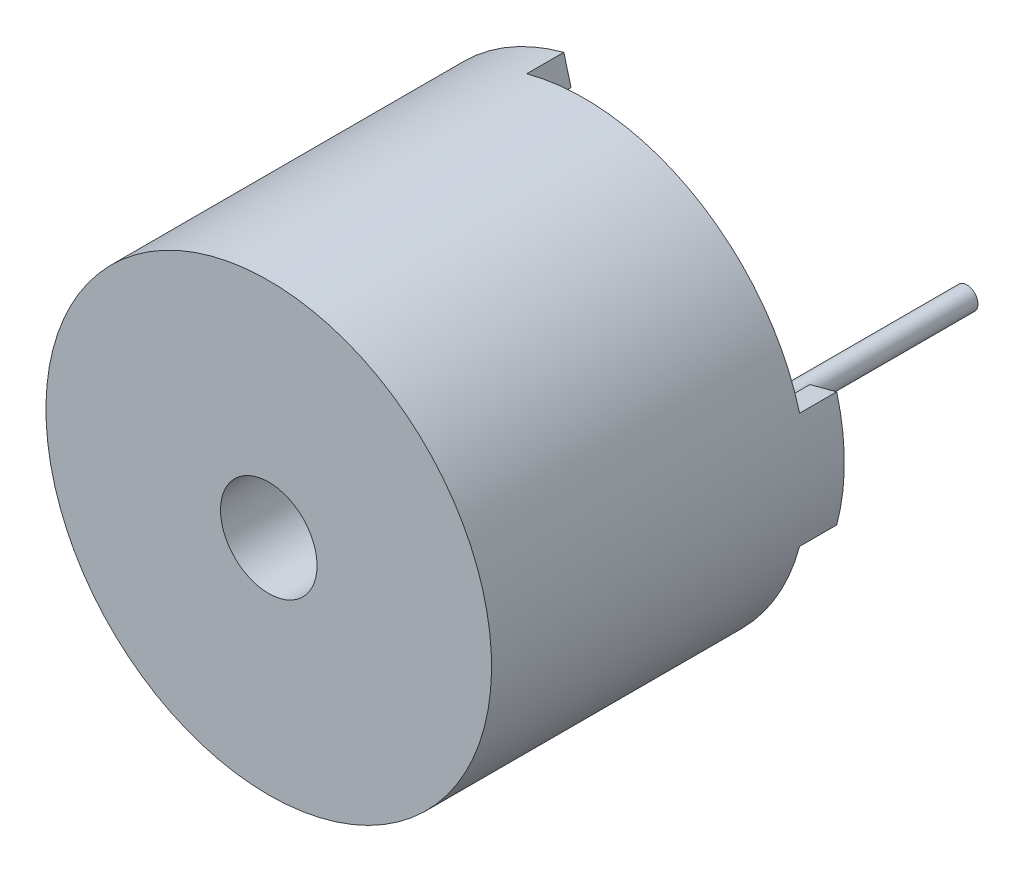
ISO-10303-21;
HEADER;
FILE_DESCRIPTION(('STEP AP214'),'2;1');
FILE_NAME('part.step','',(''),(''),'','','');
FILE_SCHEMA(('AUTOMOTIVE_DESIGN { 1 0 10303 214 1 1 1 1 }'));
ENDSEC;
DATA;
#1=APPLICATION_CONTEXT('core data for automotive mechanical design processes');
#2=APPLICATION_PROTOCOL_DEFINITION('international standard','automotive_design',2000,#1);
#3=PRODUCT_CONTEXT('',#1,'mechanical');
#4=PRODUCT('Part','Part','',(#3));
#5=PRODUCT_RELATED_PRODUCT_CATEGORY('part','',(#4));
#6=PRODUCT_DEFINITION_FORMATION('','',#4);
#7=PRODUCT_DEFINITION_CONTEXT('part definition',#1,'design');
#8=PRODUCT_DEFINITION('design','',#6,#7);
#9=PRODUCT_DEFINITION_SHAPE('','',#8);
#10=(LENGTH_UNIT() NAMED_UNIT(*) SI_UNIT(.MILLI.,.METRE.));
#11=(NAMED_UNIT(*) PLANE_ANGLE_UNIT() SI_UNIT($,.RADIAN.));
#12=(NAMED_UNIT(*) SI_UNIT($,.STERADIAN.) SOLID_ANGLE_UNIT());
#13=UNCERTAINTY_MEASURE_WITH_UNIT(LENGTH_MEASURE(1.E-05),#10,'distance_accuracy_value','');
#14=(GEOMETRIC_REPRESENTATION_CONTEXT(3) GLOBAL_UNCERTAINTY_ASSIGNED_CONTEXT((#13)) GLOBAL_UNIT_ASSIGNED_CONTEXT((#10,
#11,#12)) REPRESENTATION_CONTEXT('',''));
#15=CARTESIAN_POINT('',(0.,0.,0.));
#16=DIRECTION('',(0.,0.,1.));
#17=DIRECTION('',(1.,0.,0.));
#18=AXIS2_PLACEMENT_3D('',#15,#16,#17);
#19=CARTESIAN_POINT('',(-3.79990601999888,6.62060997299818E-05,-3.));
#20=DIRECTION('',(0.,0.,1.));
#21=DIRECTION('',(-4.37113882867379E-08,-0.999999999999999,0.));
#22=AXIS2_PLACEMENT_3D('',#19,#20,#21);
#23=CYLINDRICAL_SURFACE('',#22,0.3);
#24=CARTESIAN_POINT('',(-3.79990601999888,6.62060997299818E-05,-3.));
#25=DIRECTION('',(0.,0.,-1.));
#26=DIRECTION('',(4.37113882867379E-08,0.999999999999999,0.));
#27=AXIS2_PLACEMENT_3D('',#24,#25,#26);
#28=CIRCLE('',#27,0.3);
#29=CARTESIAN_POINT('',(-3.79990600688547,0.30006620609973,-3.));
#30=VERTEX_POINT('',#29);
#31=EDGE_CURVE('P0_E11',#30,#30,#28,.T.);
#32=ORIENTED_EDGE('',*,*,#31,.F.);
#33=CARTESIAN_POINT('',(-3.79990600688547,0.30006620609973,-3.));
#34=CARTESIAN_POINT('',(-3.79990600688547,0.30006620609973,1.));
#35=B_SPLINE_CURVE_WITH_KNOTS('',1,(#33,#34),.UNSPECIFIED.,.F.,.F.,(2,2),(0.,4.),.UNSPECIFIED.);
#36=CARTESIAN_POINT('',(-3.79990600688547,0.30006620609973,1.));
#37=VERTEX_POINT('',#36);
#38=EDGE_CURVE('P0_E23',#30,#37,#35,.T.);
#39=ORIENTED_EDGE('',*,*,#38,.T.);
#40=CARTESIAN_POINT('',(-3.79990601999888,6.62060997299818E-05,1.));
#41=DIRECTION('',(0.,0.,-1.));
#42=DIRECTION('',(4.37113882867379E-08,0.999999999999999,0.));
#43=AXIS2_PLACEMENT_3D('',#40,#41,#42);
#44=CIRCLE('',#43,0.3);
#45=EDGE_CURVE('P0_E32',#37,#37,#44,.T.);
#46=ORIENTED_EDGE('',*,*,#45,.T.);
#47=ORIENTED_EDGE('',*,*,#38,.F.);
#48=EDGE_LOOP('',(#32,#39,#46,#47));
#49=FACE_BOUND('',#48,.T.);
#50=ADVANCED_FACE('P0_F16',(#49),#23,.T.);
#51=CARTESIAN_POINT('',(9.39800011110492E-05,6.60399964544922E-05,-3.));
#52=DIRECTION('',(0.,0.,-1.));
#53=DIRECTION('',(4.37113882867379E-08,0.999999999999999,0.));
#54=AXIS2_PLACEMENT_3D('',#51,#52,#53);
#55=PLANE('',#54);
#56=ORIENTED_EDGE('',*,*,#31,.T.);
#57=EDGE_LOOP('',(#56));
#58=FACE_BOUND('',#57,.T.);
#59=ADVANCED_FACE('P0_F42',(#58),#55,.T.);
#60=CARTESIAN_POINT('',(9.39800011110492E-05,6.60399964544922E-05,1.));
#61=DIRECTION('',(0.,0.,-1.));
#62=DIRECTION('',(4.37113882867379E-08,0.999999999999999,0.));
#63=AXIS2_PLACEMENT_3D('',#60,#61,#62);
#64=PLANE('',#63);
#65=ORIENTED_EDGE('',*,*,#45,.F.);
#66=EDGE_LOOP('',(#65));
#67=FACE_BOUND('',#66,.T.);
#68=ADVANCED_FACE('P0_F40',(#67),#64,.F.);
#69=CLOSED_SHELL('',(#50,#59,#68));
#70=MANIFOLD_SOLID_BREP('P0_B1',#69);
#71=CARTESIAN_POINT('',(9.39800011110492E-05,6.60399964544922E-05,1.));
#72=DIRECTION('',(0.,0.,-1.));
#73=DIRECTION('',(4.37113882867379E-08,0.999999999999999,0.));
#74=AXIS2_PLACEMENT_3D('',#71,#72,#73);
#75=PLANE('',#74);
#76=CARTESIAN_POINT('',(3.80009398000111,6.58738931776065E-05,1.));
#77=DIRECTION('',(0.,0.,-1.));
#78=DIRECTION('',(4.37113882867379E-08,0.999999999999999,0.));
#79=AXIS2_PLACEMENT_3D('',#76,#77,#78);
#80=CIRCLE('',#79,0.3);
#81=CARTESIAN_POINT('',(3.80009399311452,0.300065873893177,1.));
#82=VERTEX_POINT('',#81);
#83=CARTESIAN_POINT('',(3.80009396688769,-0.299934126106822,1.));
#84=VERTEX_POINT('',#83);
#85=EDGE_CURVE('P1_E11',#82,#84,#80,.T.);
#86=ORIENTED_EDGE('',*,*,#85,.F.);
#87=CARTESIAN_POINT('',(3.80009398000111,6.58738931776065E-05,1.));
#88=DIRECTION('',(0.,0.,-1.));
#89=DIRECTION('',(4.37113882867379E-08,0.999999999999999,0.));
#90=AXIS2_PLACEMENT_3D('',#87,#88,#89);
#91=CIRCLE('',#90,0.3);
#92=EDGE_CURVE('P1_E23',#84,#82,#91,.T.);
#93=ORIENTED_EDGE('',*,*,#92,.F.);
#94=EDGE_LOOP('',(#86,#93));
#95=FACE_BOUND('',#94,.T.);
#96=ADVANCED_FACE('P1_F16',(#95),#75,.F.);
#97=CARTESIAN_POINT('',(3.80009398000111,6.58738931776065E-05,-11.8485281374238));
#98=DIRECTION('',(0.,0.,1.));
#99=DIRECTION('',(-4.37113882867379E-08,-0.999999999999999,0.));
#100=AXIS2_PLACEMENT_3D('',#97,#98,#99);
#101=CYLINDRICAL_SURFACE('',#100,0.3);
#102=CARTESIAN_POINT('',(3.80009398000111,6.58738931776065E-05,-5.5));
#103=DIRECTION('',(0.,0.,1.));
#104=DIRECTION('',(-4.37113882867379E-08,-0.999999999999999,0.));
#105=AXIS2_PLACEMENT_3D('',#102,#103,#104);
#106=CIRCLE('',#105,0.3);
#107=CARTESIAN_POINT('',(3.80009396688769,-0.299934126106822,-5.5));
#108=VERTEX_POINT('',#107);
#109=EDGE_CURVE('P1_E36',#108,#108,#106,.T.);
#110=ORIENTED_EDGE('',*,*,#109,.T.);
#111=CARTESIAN_POINT('',(3.80009396688769,-0.299934126106822,-5.5));
#112=CARTESIAN_POINT('',(3.80009396688769,-0.299934126106822,1.));
#113=B_SPLINE_CURVE_WITH_KNOTS('',1,(#111,#112),.UNSPECIFIED.,.F.,.F.,(2,2),(6.34852813742385,
12.8485281374239),.UNSPECIFIED.);
#114=EDGE_CURVE('P1_E38',#108,#84,#113,.T.);
#115=ORIENTED_EDGE('',*,*,#114,.T.);
#116=ORIENTED_EDGE('',*,*,#92,.T.);
#117=ORIENTED_EDGE('',*,*,#85,.T.);
#118=ORIENTED_EDGE('',*,*,#114,.F.);
#119=EDGE_LOOP('',(#110,#115,#116,#117,#118));
#120=FACE_BOUND('',#119,.T.);
#121=ADVANCED_FACE('P1_F37',(#120),#101,.T.);
#122=CARTESIAN_POINT('',(9.39800011110492E-05,6.60399964544922E-05,-5.5));
#123=DIRECTION('',(0.,0.,1.));
#124=DIRECTION('',(-4.37113882867379E-08,-0.999999999999999,0.));
#125=AXIS2_PLACEMENT_3D('',#122,#123,#124);
#126=PLANE('',#125);
#127=ORIENTED_EDGE('',*,*,#109,.F.);
#128=EDGE_LOOP('',(#127));
#129=FACE_BOUND('',#128,.T.);
#130=ADVANCED_FACE('P1_F52',(#129),#126,.F.);
#131=CLOSED_SHELL('',(#96,#121,#130));
#132=MANIFOLD_SOLID_BREP('P1_B1',#131);
#133=CARTESIAN_POINT('',(9.39800011110492E-05,6.60399964544922E-05,0.));
#134=DIRECTION('',(0.,0.,1.));
#135=DIRECTION('',(-4.37113882867379E-08,-0.999999999999999,0.));
#136=AXIS2_PLACEMENT_3D('',#133,#134,#135);
#137=PLANE('',#136);
#138=CARTESIAN_POINT('',(9.39800011110492E-05,6.60399964544922E-05,0.));
#139=DIRECTION('',(0.,0.,-1.));
#140=DIRECTION('',(4.37113882867379E-08,0.999999999999999,0.));
#141=AXIS2_PLACEMENT_3D('',#138,#139,#140);
#142=CIRCLE('',#141,5.25);
#143=CARTESIAN_POINT('',(5.07120462741376,1.35886580511937,0.));
#144=VERTEX_POINT('',#143);
#145=CARTESIAN_POINT('',(5.07120450862367,-1.3587341684571,0.));
#146=VERTEX_POINT('',#145);
#147=EDGE_CURVE('P2_E11',#144,#146,#142,.T.);
#148=ORIENTED_EDGE('',*,*,#147,.F.);
#149=DIRECTION('',(-0.965925837602409,-0.258819002880556,0.));
#150=VECTOR('',#149,1.);
#151=CARTESIAN_POINT('',(5.07120462741376,1.35886580511937,0.));
#152=LINE('',#151,#150);
#153=CARTESIAN_POINT('',(5.79564900561556,1.55298005727979,0.));
#154=VERTEX_POINT('',#153);
#155=EDGE_CURVE('P2_E23',#154,#144,#152,.T.);
#156=ORIENTED_EDGE('',*,*,#155,.F.);
#157=CARTESIAN_POINT('',(9.39800011110492E-05,6.60399964544922E-05,0.));
#158=DIRECTION('',(0.,0.,1.));
#159=DIRECTION('',(-4.37113882867379E-08,-0.999999999999999,0.));
#160=AXIS2_PLACEMENT_3D('',#157,#158,#159);
#161=CIRCLE('',#160,6.);
#162=CARTESIAN_POINT('',(5.79564886985547,-1.55284848395047,0.));
#163=VERTEX_POINT('',#162);
#164=EDGE_CURVE('P2_E227',#163,#154,#161,.T.);
#165=ORIENTED_EDGE('',*,*,#164,.F.);
#166=DIRECTION('',(0.965925814975725,-0.258819087324488,0.));
#167=VECTOR('',#166,1.);
#168=CARTESIAN_POINT('',(5.07120450862367,-1.3587341684571,0.));
#169=LINE('',#168,#167);
#170=EDGE_CURVE('P2_E224',#146,#163,#169,.T.);
#171=ORIENTED_EDGE('',*,*,#170,.F.);
#172=EDGE_LOOP('',(#148,#156,#165,#171));
#173=FACE_BOUND('',#172,.T.);
#174=ADVANCED_FACE('P2_F16',(#173),#137,.F.);
#175=CARTESIAN_POINT('',(9.39800011110492E-05,6.60399964544922E-05,0.));
#176=DIRECTION('',(0.,0.,1.));
#177=DIRECTION('',(-4.37113882867379E-08,-0.999999999999999,0.));
#178=AXIS2_PLACEMENT_3D('',#175,#176,#177);
#179=PLANE('',#178);
#180=CARTESIAN_POINT('',(9.39800011110492E-05,6.60399964544922E-05,0.));
#181=DIRECTION('',(0.,0.,-1.));
#182=DIRECTION('',(4.37113882867379E-08,0.999999999999999,0.));
#183=AXIS2_PLACEMENT_3D('',#180,#181,#182);
#184=CIRCLE('',#183,5.25);
#185=CARTESIAN_POINT('',(-1.35870622845246,-5.0710444886261,0.));
#186=VERTEX_POINT('',#185);
#187=CARTESIAN_POINT('',(-3.7122167834985,-3.71224439896267,0.));
#188=VERTEX_POINT('',#187);
#189=EDGE_CURVE('P2_E221',#186,#188,#184,.T.);
#190=ORIENTED_EDGE('',*,*,#189,.F.);
#191=DIRECTION('',(0.25881908732449,0.965925814975725,0.));
#192=VECTOR('',#191,1.);
#193=CARTESIAN_POINT('',(-1.35870622845246,-5.0710444886261,0.));
#194=LINE('',#193,#192);
#195=CARTESIAN_POINT('',(-1.55282054394583,-5.79548884985789,0.));
#196=VERTEX_POINT('',#195);
#197=EDGE_CURVE('P2_E219',#196,#186,#194,.T.);
#198=ORIENTED_EDGE('',*,*,#197,.F.);
#199=CARTESIAN_POINT('',(9.39800011110492E-05,6.60399964544922E-05,0.));
#200=DIRECTION('',(0.,0.,1.));
#201=DIRECTION('',(-4.37113882867379E-08,-0.999999999999999,0.));
#202=AXIS2_PLACEMENT_3D('',#199,#200,#201);
#203=CIRCLE('',#202,6.);
#204=CARTESIAN_POINT('',(-4.24254689256988,-4.24257446167112,0.));
#205=VERTEX_POINT('',#204);
#206=EDGE_CURVE('P2_E216',#205,#196,#203,.T.);
#207=ORIENTED_EDGE('',*,*,#206,.F.);
#208=DIRECTION('',(-0.707106812095166,-0.707106750277928,0.));
#209=VECTOR('',#208,1.);
#210=CARTESIAN_POINT('',(-3.7122167834985,-3.71224439896267,0.));
#211=LINE('',#210,#209);
#212=EDGE_CURVE('P2_E213',#188,#205,#211,.T.);
#213=ORIENTED_EDGE('',*,*,#212,.F.);
#214=EDGE_LOOP('',(#190,#198,#207,#213));
#215=FACE_BOUND('',#214,.T.);
#216=ADVANCED_FACE('P2_F257',(#215),#179,.F.);
#217=CARTESIAN_POINT('',(9.39800011110492E-05,6.60399964544922E-05,1.));
#218=DIRECTION('',(0.,0.,-1.));
#219=DIRECTION('',(4.37113882867379E-08,0.999999999999999,0.));
#220=AXIS2_PLACEMENT_3D('',#217,#218,#219);
#221=CYLINDRICAL_SURFACE('',#220,5.25);
#222=CARTESIAN_POINT('',(9.39800011110492E-05,6.60399964544922E-05,1.));
#223=DIRECTION('',(0.,0.,-1.));
#224=DIRECTION('',(4.37113882867379E-08,0.999999999999999,0.));
#225=AXIS2_PLACEMENT_3D('',#222,#223,#224);
#226=CIRCLE('',#225,5.25);
#227=CARTESIAN_POINT('',(5.07120462741376,1.35886580511937,1.));
#228=VERTEX_POINT('',#227);
#229=CARTESIAN_POINT('',(5.07120450862367,-1.3587341684571,1.));
#230=VERTEX_POINT('',#229);
#231=EDGE_CURVE('P2_E210',#228,#230,#226,.T.);
#232=ORIENTED_EDGE('',*,*,#231,.F.);
#233=DIRECTION('',(0.,0.,-1.));
#234=VECTOR('',#233,1.);
#235=CARTESIAN_POINT('',(5.07120462741376,1.35886580511937,9.69141746567481));
#236=LINE('',#235,#234);
#237=EDGE_CURVE('P2_E208',#228,#144,#236,.T.);
#238=ORIENTED_EDGE('',*,*,#237,.T.);
#239=ORIENTED_EDGE('',*,*,#147,.T.);
#240=DIRECTION('',(0.,0.,-1.));
#241=VECTOR('',#240,1.);
#242=CARTESIAN_POINT('',(5.07120450862367,-1.3587341684571,9.69141746567482));
#243=LINE('',#242,#241);
#244=EDGE_CURVE('P2_E206',#230,#146,#243,.T.);
#245=ORIENTED_EDGE('',*,*,#244,.F.);
#246=EDGE_LOOP('',(#232,#238,#239,#245));
#247=FACE_BOUND('',#246,.T.);
#248=ADVANCED_FACE('P2_F234',(#247),#221,.F.);
#249=CARTESIAN_POINT('',(9.39800011110492E-05,6.60399964544922E-05,1.));
#250=DIRECTION('',(0.,0.,-1.));
#251=DIRECTION('',(4.37113882867379E-08,0.999999999999999,0.));
#252=AXIS2_PLACEMENT_3D('',#249,#250,#251);
#253=CYLINDRICAL_SURFACE('',#252,5.25);
#254=CARTESIAN_POINT('',(9.39800011110492E-05,6.60399964544922E-05,1.));
#255=DIRECTION('',(0.,0.,-1.));
#256=DIRECTION('',(4.37113882867379E-08,0.999999999999999,0.));
#257=AXIS2_PLACEMENT_3D('',#254,#255,#256);
#258=CIRCLE('',#257,5.25);
#259=CARTESIAN_POINT('',(-1.35870622845246,-5.0710444886261,1.));
#260=VERTEX_POINT('',#259);
#261=CARTESIAN_POINT('',(-3.7122167834985,-3.71224439896267,1.));
#262=VERTEX_POINT('',#261);
#263=EDGE_CURVE('P2_E204',#260,#262,#258,.T.);
#264=ORIENTED_EDGE('',*,*,#263,.F.);
#265=DIRECTION('',(0.,0.,-1.));
#266=VECTOR('',#265,1.);
#267=CARTESIAN_POINT('',(-1.35870622845246,-5.0710444886261,9.69141746567482));
#268=LINE('',#267,#266);
#269=EDGE_CURVE('P2_E201',#260,#186,#268,.T.);
#270=ORIENTED_EDGE('',*,*,#269,.T.);
#271=ORIENTED_EDGE('',*,*,#189,.T.);
#272=DIRECTION('',(0.,0.,-1.));
#273=VECTOR('',#272,1.);
#274=CARTESIAN_POINT('',(-3.7122167834985,-3.71224439896267,9.78826050963715));
#275=LINE('',#274,#273);
#276=EDGE_CURVE('P2_E198',#262,#188,#275,.T.);
#277=ORIENTED_EDGE('',*,*,#276,.F.);
#278=EDGE_LOOP('',(#264,#270,#271,#277));
#279=FACE_BOUND('',#278,.T.);
#280=ADVANCED_FACE('P2_F252',(#279),#253,.F.);
#281=CARTESIAN_POINT('',(9.39800011110492E-05,6.60399964544922E-05,9.5));
#282=DIRECTION('',(0.,0.,-1.));
#283=DIRECTION('',(4.37113882867379E-08,0.999999999999999,0.));
#284=AXIS2_PLACEMENT_3D('',#281,#282,#283);
#285=CYLINDRICAL_SURFACE('',#284,6.);
#286=ORIENTED_EDGE('',*,*,#164,.T.);
#287=DIRECTION('',(0.,0.,-1.));
#288=VECTOR('',#287,1.);
#289=CARTESIAN_POINT('',(5.79564900561556,1.55298005727979,9.69141746567481));
#290=LINE('',#289,#288);
#291=CARTESIAN_POINT('',(5.79564900561556,1.55298005727979,1.));
#292=VERTEX_POINT('',#291);
#293=EDGE_CURVE('P2_E195',#292,#154,#290,.T.);
#294=ORIENTED_EDGE('',*,*,#293,.F.);
#295=CARTESIAN_POINT('',(9.39800011110492E-05,6.60399964544922E-05,1.));
#296=DIRECTION('',(0.,0.,1.));
#297=DIRECTION('',(4.37113882867379E-08,0.999999999999999,0.));
#298=AXIS2_PLACEMENT_3D('',#295,#296,#297);
#299=CIRCLE('',#298,6.);
#300=CARTESIAN_POINT('',(-1.55282003728224,5.7956210656109,1.));
#301=VERTEX_POINT('',#300);
#302=EDGE_CURVE('P2_E189',#292,#301,#299,.T.);
#303=ORIENTED_EDGE('',*,*,#302,.T.);
#304=CARTESIAN_POINT('',(-1.55282003728225,5.7956210656109,9.5));
#305=CARTESIAN_POINT('',(-1.55282003728225,5.7956210656109,1.));
#306=B_SPLINE_CURVE_WITH_KNOTS('',1,(#304,#305),.UNSPECIFIED.,.F.,.F.,(2,2),(0.,8.5),.UNSPECIFIED.);
#307=CARTESIAN_POINT('',(-1.55282003728224,5.7956210656109,9.5));
#308=VERTEX_POINT('',#307);
#309=EDGE_CURVE('P2_E184',#308,#301,#306,.T.);
#310=ORIENTED_EDGE('',*,*,#309,.F.);
#311=CARTESIAN_POINT('',(9.39800011110492E-05,6.60399964544922E-05,9.5));
#312=DIRECTION('',(0.,0.,1.));
#313=DIRECTION('',(-4.37113882867379E-08,-0.999999999999999,0.));
#314=AXIS2_PLACEMENT_3D('',#311,#312,#313);
#315=CIRCLE('',#314,6.);
#316=CARTESIAN_POINT('',(9.3717732780594E-05,-5.99993396000354,9.5));
#317=VERTEX_POINT('',#316);
#318=EDGE_CURVE('P2_E181',#317,#308,#315,.T.);
#319=ORIENTED_EDGE('',*,*,#318,.F.);
#320=CARTESIAN_POINT('',(9.39800011110492E-05,6.60399964544922E-05,9.5));
#321=DIRECTION('',(0.,0.,1.));
#322=DIRECTION('',(-4.37113882867379E-08,-0.999999999999999,0.));
#323=AXIS2_PLACEMENT_3D('',#320,#321,#322);
#324=CIRCLE('',#323,6.);
#325=EDGE_CURVE('P2_E179',#308,#317,#324,.T.);
#326=ORIENTED_EDGE('',*,*,#325,.F.);
#327=ORIENTED_EDGE('',*,*,#309,.T.);
#328=DIRECTION('',(0.,0.,-1.));
#329=VECTOR('',#328,1.);
#330=CARTESIAN_POINT('',(-1.55282003728224,5.7956210656109,9.69141746567481));
#331=LINE('',#330,#329);
#332=CARTESIAN_POINT('',(-1.55282003728224,5.7956210656109,0.));
#333=VERTEX_POINT('',#332);
#334=EDGE_CURVE('P2_E176',#301,#333,#331,.T.);
#335=ORIENTED_EDGE('',*,*,#334,.T.);
#336=CARTESIAN_POINT('',(9.39800011110492E-05,6.60399964544922E-05,0.));
#337=DIRECTION('',(0.,0.,1.));
#338=DIRECTION('',(-4.37113882867379E-08,-0.999999999999999,0.));
#339=AXIS2_PLACEMENT_3D('',#336,#337,#338);
#340=CIRCLE('',#339,6.);
#341=CARTESIAN_POINT('',(-4.24254652166645,4.24270691256746,0.));
#342=VERTEX_POINT('',#341);
#343=EDGE_CURVE('P2_E173',#333,#342,#340,.T.);
#344=ORIENTED_EDGE('',*,*,#343,.T.);
#345=DIRECTION('',(0.,0.,-1.));
#346=VECTOR('',#345,1.);
#347=CARTESIAN_POINT('',(-4.24254652166645,4.24270691256746,9.78826050963715));
#348=LINE('',#347,#346);
#349=CARTESIAN_POINT('',(-4.24254652166645,4.24270691256746,1.));
#350=VERTEX_POINT('',#349);
#351=EDGE_CURVE('P2_E171',#350,#342,#348,.T.);
#352=ORIENTED_EDGE('',*,*,#351,.F.);
#353=CARTESIAN_POINT('',(9.39800011110492E-05,6.60399964544922E-05,1.));
#354=DIRECTION('',(0.,0.,1.));
#355=DIRECTION('',(4.37113882867379E-08,0.999999999999999,0.));
#356=AXIS2_PLACEMENT_3D('',#353,#354,#355);
#357=CIRCLE('',#356,6.);
#358=CARTESIAN_POINT('',(-4.24254689256988,-4.24257446167112,1.));
#359=VERTEX_POINT('',#358);
#360=EDGE_CURVE('P2_E129',#350,#359,#357,.T.);
#361=ORIENTED_EDGE('',*,*,#360,.T.);
#362=DIRECTION('',(0.,0.,-1.));
#363=VECTOR('',#362,1.);
#364=CARTESIAN_POINT('',(-4.24254689256988,-4.24257446167112,9.78826050963715));
#365=LINE('',#364,#363);
#366=EDGE_CURVE('P2_E168',#359,#205,#365,.T.);
#367=ORIENTED_EDGE('',*,*,#366,.T.);
#368=ORIENTED_EDGE('',*,*,#206,.T.);
#369=DIRECTION('',(0.,0.,-1.));
#370=VECTOR('',#369,1.);
#371=CARTESIAN_POINT('',(-1.55282054394583,-5.79548884985789,9.69141746567482));
#372=LINE('',#371,#370);
#373=CARTESIAN_POINT('',(-1.55282054394583,-5.7954888498579,1.));
#374=VERTEX_POINT('',#373);
#375=EDGE_CURVE('P2_E166',#374,#196,#372,.T.);
#376=ORIENTED_EDGE('',*,*,#375,.F.);
#377=CARTESIAN_POINT('',(9.39800011110492E-05,6.60399964544922E-05,1.));
#378=DIRECTION('',(0.,0.,1.));
#379=DIRECTION('',(4.37113882867379E-08,0.999999999999999,0.));
#380=AXIS2_PLACEMENT_3D('',#377,#378,#379);
#381=CIRCLE('',#380,6.);
#382=CARTESIAN_POINT('',(5.79564886985547,-1.55284848395047,1.));
#383=VERTEX_POINT('',#382);
#384=EDGE_CURVE('P2_E163',#374,#383,#381,.T.);
#385=ORIENTED_EDGE('',*,*,#384,.T.);
#386=DIRECTION('',(0.,0.,-1.));
#387=VECTOR('',#386,1.);
#388=CARTESIAN_POINT('',(5.79564886985547,-1.55284848395047,9.69141746567482));
#389=LINE('',#388,#387);
#390=EDGE_CURVE('P2_E161',#383,#163,#389,.T.);
#391=ORIENTED_EDGE('',*,*,#390,.T.);
#392=EDGE_LOOP('',(#286,#294,#303,#310,#319,#326,#327,#335,#344,#352,#361,#367,#368,#376,#385,#391));
#393=FACE_BOUND('',#392,.T.);
#394=ADVANCED_FACE('P2_F260',(#393),#285,.T.);
#395=CARTESIAN_POINT('',(9.39800011110492E-05,6.60399964544922E-05,9.5));
#396=DIRECTION('',(0.,0.,1.));
#397=DIRECTION('',(-4.37113882867379E-08,-0.999999999999999,0.));
#398=AXIS2_PLACEMENT_3D('',#395,#396,#397);
#399=PLANE('',#398);
#400=CARTESIAN_POINT('',(9.39800011110492E-05,6.60399964544922E-05,9.5));
#401=DIRECTION('',(0.,0.,1.));
#402=DIRECTION('',(-4.37113882867379E-08,-0.999999999999999,0.));
#403=AXIS2_PLACEMENT_3D('',#400,#401,#402);
#404=CIRCLE('',#403,1.3);
#405=CARTESIAN_POINT('',(9.39231763061172E-05,-1.29993396000354,9.5));
#406=VERTEX_POINT('',#405);
#407=EDGE_CURVE('P2_E159',#406,#406,#404,.T.);
#408=ORIENTED_EDGE('',*,*,#407,.F.);
#409=EDGE_LOOP('',(#408));
#410=FACE_BOUND('',#409,.T.);
#411=ORIENTED_EDGE('',*,*,#318,.T.);
#412=ORIENTED_EDGE('',*,*,#325,.T.);
#413=EDGE_LOOP('',(#411,#412));
#414=FACE_BOUND('',#413,.T.);
#415=ADVANCED_FACE('P2_F271',(#410,#414),#399,.T.);
#416=CARTESIAN_POINT('',(9.39800011110492E-05,6.60399964544922E-05,0.));
#417=DIRECTION('',(0.,0.,1.));
#418=DIRECTION('',(-4.37113882867379E-08,-0.999999999999999,0.));
#419=AXIS2_PLACEMENT_3D('',#416,#417,#418);
#420=PLANE('',#419);
#421=ORIENTED_EDGE('',*,*,#343,.F.);
#422=DIRECTION('',(-0.258819002880558,0.965925837602408,0.));
#423=VECTOR('',#422,1.);
#424=CARTESIAN_POINT('',(-1.35870578512182,5.0711766874091,0.));
#425=LINE('',#424,#423);
#426=CARTESIAN_POINT('',(-1.35870578512182,5.0711766874091,0.));
#427=VERTEX_POINT('',#426);
#428=EDGE_CURVE('P2_E157',#427,#333,#425,.T.);
#429=ORIENTED_EDGE('',*,*,#428,.F.);
#430=CARTESIAN_POINT('',(9.39800011110492E-05,6.60399964544922E-05,0.));
#431=DIRECTION('',(0.,0.,-1.));
#432=DIRECTION('',(4.37113882867379E-08,0.999999999999999,0.));
#433=AXIS2_PLACEMENT_3D('',#430,#431,#432);
#434=CIRCLE('',#433,5.25);
#435=CARTESIAN_POINT('',(-3.712216458958,3.71237680349608,0.));
#436=VERTEX_POINT('',#435);
#437=EDGE_CURVE('P2_E155',#436,#427,#434,.T.);
#438=ORIENTED_EDGE('',*,*,#437,.F.);
#439=DIRECTION('',(0.707106750277927,-0.707106812095167,0.));
#440=VECTOR('',#439,1.);
#441=CARTESIAN_POINT('',(-3.712216458958,3.71237680349608,0.));
#442=LINE('',#441,#440);
#443=EDGE_CURVE('P2_E136',#342,#436,#442,.T.);
#444=ORIENTED_EDGE('',*,*,#443,.F.);
#445=EDGE_LOOP('',(#421,#429,#438,#444));
#446=FACE_BOUND('',#445,.T.);
#447=ADVANCED_FACE('P2_F263',(#446),#420,.F.);
#448=CARTESIAN_POINT('',(9.39800011110492E-05,6.60399964544922E-05,6.5));
#449=DIRECTION('',(0.,0.,1.));
#450=DIRECTION('',(-4.37113882867379E-08,-0.999999999999999,0.));
#451=AXIS2_PLACEMENT_3D('',#448,#449,#450);
#452=CYLINDRICAL_SURFACE('',#451,1.3);
#453=CARTESIAN_POINT('',(9.39231763062765E-05,-1.29993396000354,6.5));
#454=CARTESIAN_POINT('',(9.39231763062765E-05,-1.29993396000354,9.5));
#455=B_SPLINE_CURVE_WITH_KNOTS('',1,(#453,#454),.UNSPECIFIED.,.F.,.F.,(2,2),(0.,3.),.UNSPECIFIED.);
#456=CARTESIAN_POINT('',(9.39231763061172E-05,-1.29993396000354,6.5));
#457=VERTEX_POINT('',#456);
#458=EDGE_CURVE('P2_E146',#457,#406,#455,.T.);
#459=ORIENTED_EDGE('',*,*,#458,.T.);
#460=ORIENTED_EDGE('',*,*,#407,.T.);
#461=ORIENTED_EDGE('',*,*,#458,.F.);
#462=CARTESIAN_POINT('',(9.39800011110492E-05,6.60399964544922E-05,6.5));
#463=DIRECTION('',(0.,0.,1.));
#464=DIRECTION('',(-4.37113882867379E-08,-0.999999999999999,0.));
#465=AXIS2_PLACEMENT_3D('',#462,#463,#464);
#466=CIRCLE('',#465,1.3);
#467=EDGE_CURVE('P2_E144',#457,#457,#466,.T.);
#468=ORIENTED_EDGE('',*,*,#467,.F.);
#469=EDGE_LOOP('',(#459,#460,#461,#468));
#470=FACE_BOUND('',#469,.T.);
#471=ADVANCED_FACE('P2_F280',(#470),#452,.F.);
#472=CARTESIAN_POINT('',(9.39800011110492E-05,6.60399964544922E-05,6.5));
#473=DIRECTION('',(0.,0.,1.));
#474=DIRECTION('',(-4.37113882867379E-08,-0.999999999999999,0.));
#475=AXIS2_PLACEMENT_3D('',#472,#473,#474);
#476=PLANE('',#475);
#477=ORIENTED_EDGE('',*,*,#467,.T.);
#478=EDGE_LOOP('',(#477));
#479=FACE_BOUND('',#478,.T.);
#480=ADVANCED_FACE('P2_F329',(#479),#476,.T.);
#481=CARTESIAN_POINT('',(9.39800011110492E-05,6.60399964544922E-05,1.));
#482=DIRECTION('',(0.,0.,-1.));
#483=DIRECTION('',(4.37113882867379E-08,0.999999999999999,0.));
#484=AXIS2_PLACEMENT_3D('',#481,#482,#483);
#485=CYLINDRICAL_SURFACE('',#484,5.25);
#486=ORIENTED_EDGE('',*,*,#437,.T.);
#487=DIRECTION('',(0.,0.,-1.));
#488=VECTOR('',#487,1.);
#489=CARTESIAN_POINT('',(-1.35870578512182,5.0711766874091,9.69141746567481));
#490=LINE('',#489,#488);
#491=CARTESIAN_POINT('',(-1.35870578512182,5.0711766874091,1.));
#492=VERTEX_POINT('',#491);
#493=EDGE_CURVE('P2_E121',#492,#427,#490,.T.);
#494=ORIENTED_EDGE('',*,*,#493,.F.);
#495=CARTESIAN_POINT('',(9.39800011110492E-05,6.60399964544922E-05,1.));
#496=DIRECTION('',(0.,0.,-1.));
#497=DIRECTION('',(4.37113882867379E-08,0.999999999999999,0.));
#498=AXIS2_PLACEMENT_3D('',#495,#496,#497);
#499=CIRCLE('',#498,5.25);
#500=CARTESIAN_POINT('',(-3.712216458958,3.71237680349608,1.));
#501=VERTEX_POINT('',#500);
#502=EDGE_CURVE('P2_E115',#501,#492,#499,.T.);
#503=ORIENTED_EDGE('',*,*,#502,.F.);
#504=DIRECTION('',(0.,0.,-1.));
#505=VECTOR('',#504,1.);
#506=CARTESIAN_POINT('',(-3.712216458958,3.71237680349608,9.78826050963715));
#507=LINE('',#506,#505);
#508=EDGE_CURVE('P2_E119',#501,#436,#507,.T.);
#509=ORIENTED_EDGE('',*,*,#508,.T.);
#510=EDGE_LOOP('',(#486,#494,#503,#509));
#511=FACE_BOUND('',#510,.T.);
#512=ADVANCED_FACE('P2_F117',(#511),#485,.F.);
#513=CARTESIAN_POINT('',(9.39800011110492E-05,6.60399964544922E-05,1.));
#514=DIRECTION('',(0.,0.,-1.));
#515=DIRECTION('',(4.37113882867379E-08,0.999999999999999,0.));
#516=AXIS2_PLACEMENT_3D('',#513,#514,#515);
#517=PLANE('',#516);
#518=ORIENTED_EDGE('',*,*,#502,.T.);
#519=DIRECTION('',(0.258819002880558,-0.965925837602408,0.));
#520=VECTOR('',#519,1.);
#521=CARTESIAN_POINT('',(-1.35870578512182,5.0711766874091,1.));
#522=LINE('',#521,#520);
#523=EDGE_CURVE('P2_E137',#301,#492,#522,.T.);
#524=ORIENTED_EDGE('',*,*,#523,.F.);
#525=ORIENTED_EDGE('',*,*,#302,.F.);
#526=DIRECTION('',(0.965925837602409,0.258819002880556,0.));
#527=VECTOR('',#526,1.);
#528=CARTESIAN_POINT('',(5.07120462741376,1.35886580511937,1.));
#529=LINE('',#528,#527);
#530=EDGE_CURVE('P2_E139',#228,#292,#529,.T.);
#531=ORIENTED_EDGE('',*,*,#530,.F.);
#532=ORIENTED_EDGE('',*,*,#231,.T.);
#533=DIRECTION('',(-0.965925814975725,0.258819087324488,0.));
#534=VECTOR('',#533,1.);
#535=CARTESIAN_POINT('',(5.07120450862367,-1.3587341684571,1.));
#536=LINE('',#535,#534);
#537=EDGE_CURVE('P2_E238',#383,#230,#536,.T.);
#538=ORIENTED_EDGE('',*,*,#537,.F.);
#539=ORIENTED_EDGE('',*,*,#384,.F.);
#540=DIRECTION('',(-0.25881908732449,-0.965925814975725,0.));
#541=VECTOR('',#540,1.);
#542=CARTESIAN_POINT('',(-1.35870622845246,-5.0710444886261,1.));
#543=LINE('',#542,#541);
#544=EDGE_CURVE('P2_E240',#260,#374,#543,.T.);
#545=ORIENTED_EDGE('',*,*,#544,.F.);
#546=ORIENTED_EDGE('',*,*,#263,.T.);
#547=DIRECTION('',(0.707106812095166,0.707106750277928,0.));
#548=VECTOR('',#547,1.);
#549=CARTESIAN_POINT('',(-3.7122167834985,-3.71224439896267,1.));
#550=LINE('',#549,#548);
#551=EDGE_CURVE('P2_E131',#359,#262,#550,.T.);
#552=ORIENTED_EDGE('',*,*,#551,.F.);
#553=ORIENTED_EDGE('',*,*,#360,.F.);
#554=DIRECTION('',(-0.707106750277927,0.707106812095167,0.));
#555=VECTOR('',#554,1.);
#556=CARTESIAN_POINT('',(-3.712216458958,3.71237680349608,1.));
#557=LINE('',#556,#555);
#558=EDGE_CURVE('P2_E126',#501,#350,#557,.T.);
#559=ORIENTED_EDGE('',*,*,#558,.F.);
#560=EDGE_LOOP('',(#518,#524,#525,#531,#532,#538,#539,#545,#546,#552,#553,#559));
#561=FACE_BOUND('',#560,.T.);
#562=ADVANCED_FACE('P2_F127',(#561),#517,.T.);
#563=CARTESIAN_POINT('',(-3.712216458958,3.71237680349608,9.78826050963715));
#564=DIRECTION('',(0.707106812095167,0.707106750277927,0.));
#565=DIRECTION('',(-0.707106750277927,0.707106812095167,0.));
#566=AXIS2_PLACEMENT_3D('',#563,#564,#565);
#567=PLANE('',#566);
#568=ORIENTED_EDGE('',*,*,#558,.T.);
#569=ORIENTED_EDGE('',*,*,#351,.T.);
#570=ORIENTED_EDGE('',*,*,#443,.T.);
#571=ORIENTED_EDGE('',*,*,#508,.F.);
#572=EDGE_LOOP('',(#568,#569,#570,#571));
#573=FACE_BOUND('',#572,.T.);
#574=ADVANCED_FACE('P2_F134',(#573),#567,.F.);
#575=CARTESIAN_POINT('',(-3.7122167834985,-3.71224439896267,9.78826050963715));
#576=DIRECTION('',(0.707106750277928,-0.707106812095166,0.));
#577=DIRECTION('',(0.707106812095166,0.707106750277928,0.));
#578=AXIS2_PLACEMENT_3D('',#575,#576,#577);
#579=PLANE('',#578);
#580=ORIENTED_EDGE('',*,*,#551,.T.);
#581=ORIENTED_EDGE('',*,*,#276,.T.);
#582=ORIENTED_EDGE('',*,*,#212,.T.);
#583=ORIENTED_EDGE('',*,*,#366,.F.);
#584=EDGE_LOOP('',(#580,#581,#582,#583));
#585=FACE_BOUND('',#584,.T.);
#586=ADVANCED_FACE('P2_F249',(#585),#579,.F.);
#587=CARTESIAN_POINT('',(-1.35870622845246,-5.0710444886261,9.69141746567482));
#588=DIRECTION('',(-0.965925814975725,0.25881908732449,0.));
#589=DIRECTION('',(-0.25881908732449,-0.965925814975725,0.));
#590=AXIS2_PLACEMENT_3D('',#587,#588,#589);
#591=PLANE('',#590);
#592=ORIENTED_EDGE('',*,*,#544,.T.);
#593=ORIENTED_EDGE('',*,*,#375,.T.);
#594=ORIENTED_EDGE('',*,*,#197,.T.);
#595=ORIENTED_EDGE('',*,*,#269,.F.);
#596=EDGE_LOOP('',(#592,#593,#594,#595));
#597=FACE_BOUND('',#596,.T.);
#598=ADVANCED_FACE('P2_F375',(#597),#591,.F.);
#599=CARTESIAN_POINT('',(5.07120450862367,-1.3587341684571,9.69141746567482));
#600=DIRECTION('',(0.258819087324488,0.965925814975725,0.));
#601=DIRECTION('',(-0.965925814975725,0.258819087324488,0.));
#602=AXIS2_PLACEMENT_3D('',#599,#600,#601);
#603=PLANE('',#602);
#604=ORIENTED_EDGE('',*,*,#537,.T.);
#605=ORIENTED_EDGE('',*,*,#244,.T.);
#606=ORIENTED_EDGE('',*,*,#170,.T.);
#607=ORIENTED_EDGE('',*,*,#390,.F.);
#608=EDGE_LOOP('',(#604,#605,#606,#607));
#609=FACE_BOUND('',#608,.T.);
#610=ADVANCED_FACE('P2_F384',(#609),#603,.F.);
#611=CARTESIAN_POINT('',(5.07120462741376,1.35886580511937,9.69141746567481));
#612=DIRECTION('',(0.258819002880556,-0.965925837602409,0.));
#613=DIRECTION('',(0.965925837602409,0.258819002880556,0.));
#614=AXIS2_PLACEMENT_3D('',#611,#612,#613);
#615=PLANE('',#614);
#616=ORIENTED_EDGE('',*,*,#530,.T.);
#617=ORIENTED_EDGE('',*,*,#293,.T.);
#618=ORIENTED_EDGE('',*,*,#155,.T.);
#619=ORIENTED_EDGE('',*,*,#237,.F.);
#620=EDGE_LOOP('',(#616,#617,#618,#619));
#621=FACE_BOUND('',#620,.T.);
#622=ADVANCED_FACE('P2_F230',(#621),#615,.F.);
#623=CARTESIAN_POINT('',(-1.35870578512182,5.0711766874091,9.69141746567481));
#624=DIRECTION('',(-0.965925837602408,-0.258819002880558,0.));
#625=DIRECTION('',(0.258819002880558,-0.965925837602408,0.));
#626=AXIS2_PLACEMENT_3D('',#623,#624,#625);
#627=PLANE('',#626);
#628=ORIENTED_EDGE('',*,*,#523,.T.);
#629=ORIENTED_EDGE('',*,*,#493,.T.);
#630=ORIENTED_EDGE('',*,*,#428,.T.);
#631=ORIENTED_EDGE('',*,*,#334,.F.);
#632=EDGE_LOOP('',(#628,#629,#630,#631));
#633=FACE_BOUND('',#632,.T.);
#634=ADVANCED_FACE('P2_F267',(#633),#627,.F.);
#635=CLOSED_SHELL('',(#174,#216,#248,#280,#394,#415,#447,#471,#480,#512,#562,#574,#586,#598,
#610,#622,#634));
#636=MANIFOLD_SOLID_BREP('P2_B1',#635);
#637=ADVANCED_BREP_SHAPE_REPRESENTATION('',(#18,#70,#132,#636),#14);
#638=SHAPE_DEFINITION_REPRESENTATION(#9,#637);
ENDSEC;
END-ISO-10303-21;
